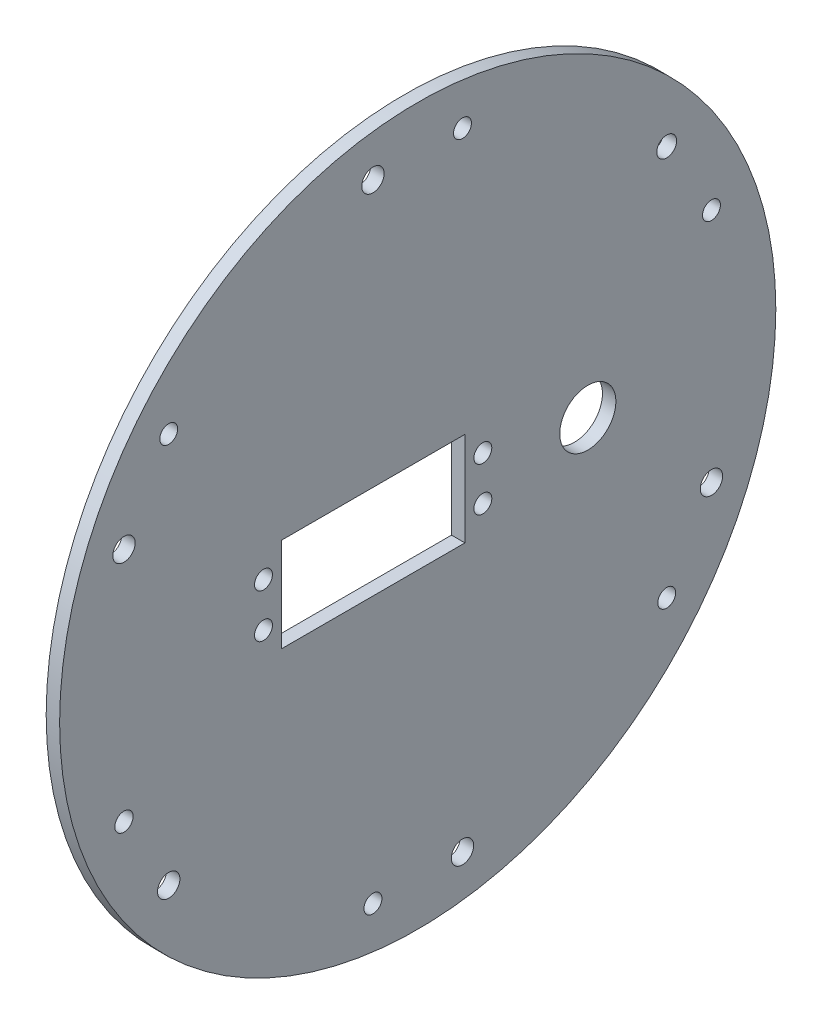
ISO-10303-21;
HEADER;
FILE_DESCRIPTION(('STEP AP214'),'2;1');
FILE_NAME('part.step','',(''),(''),'','','');
FILE_SCHEMA(('AUTOMOTIVE_DESIGN { 1 0 10303 214 1 1 1 1 }'));
ENDSEC;
DATA;
#1=APPLICATION_CONTEXT('core data for automotive mechanical design processes');
#2=APPLICATION_PROTOCOL_DEFINITION('international standard','automotive_design',2000,#1);
#3=PRODUCT_CONTEXT('',#1,'mechanical');
#4=PRODUCT('Part','Part','',(#3));
#5=PRODUCT_RELATED_PRODUCT_CATEGORY('part','',(#4));
#6=PRODUCT_DEFINITION_FORMATION('','',#4);
#7=PRODUCT_DEFINITION_CONTEXT('part definition',#1,'design');
#8=PRODUCT_DEFINITION('design','',#6,#7);
#9=PRODUCT_DEFINITION_SHAPE('','',#8);
#10=(LENGTH_UNIT() NAMED_UNIT(*) SI_UNIT(.MILLI.,.METRE.));
#11=(NAMED_UNIT(*) PLANE_ANGLE_UNIT() SI_UNIT($,.RADIAN.));
#12=(NAMED_UNIT(*) SI_UNIT($,.STERADIAN.) SOLID_ANGLE_UNIT());
#13=UNCERTAINTY_MEASURE_WITH_UNIT(LENGTH_MEASURE(1.E-05),#10,'distance_accuracy_value','');
#14=(GEOMETRIC_REPRESENTATION_CONTEXT(3) GLOBAL_UNCERTAINTY_ASSIGNED_CONTEXT((#13)) GLOBAL_UNIT_ASSIGNED_CONTEXT((#10,
#11,#12)) REPRESENTATION_CONTEXT('',''));
#15=CARTESIAN_POINT('',(0.,0.,0.));
#16=DIRECTION('',(0.,0.,1.));
#17=DIRECTION('',(1.,0.,0.));
#18=AXIS2_PLACEMENT_3D('',#15,#16,#17);
#19=CARTESIAN_POINT('',(3.,1479.49547319452,2426.87376957757));
#20=DIRECTION('',(1.,0.,0.));
#21=DIRECTION('',(0.,0.,-1.));
#22=AXIS2_PLACEMENT_3D('',#19,#20,#21);
#23=PLANE('',#22);
#24=CARTESIAN_POINT('',(3.,1435.83521915667,2482.49554784248));
#25=DIRECTION('',(1.,0.,0.));
#26=DIRECTION('',(0.,0.,-1.));
#27=AXIS2_PLACEMENT_3D('',#24,#25,#26);
#28=CIRCLE('',#27,2.5000000000001);
#29=CARTESIAN_POINT('',(3.,1435.83521915667,2479.99554784248));
#30=VERTEX_POINT('',#29);
#31=EDGE_CURVE('E117',#30,#30,#28,.T.);
#32=ORIENTED_EDGE('',*,*,#31,.F.);
#33=EDGE_LOOP('',(#32));
#34=FACE_BOUND('',#33,.T.);
#35=CARTESIAN_POINT('',(3.,1409.49547319452,2416.87376957757));
#36=DIRECTION('',(1.,0.,0.));
#37=DIRECTION('',(0.,0.,-1.));
#38=AXIS2_PLACEMENT_3D('',#35,#36,#37);
#39=CIRCLE('',#38,2.5000000000001);
#40=CARTESIAN_POINT('',(3.,1409.49547319452,2414.37376957757));
#41=VERTEX_POINT('',#40);
#42=EDGE_CURVE('E129',#41,#41,#39,.T.);
#43=ORIENTED_EDGE('',*,*,#42,.F.);
#44=EDGE_LOOP('',(#43));
#45=FACE_BOUND('',#44,.T.);
#46=CARTESIAN_POINT('',(3.,1453.15572723236,2361.25199131266));
#47=DIRECTION('',(1.,0.,0.));
#48=DIRECTION('',(0.,0.,-1.));
#49=AXIS2_PLACEMENT_3D('',#46,#47,#48);
#50=CIRCLE('',#49,2.5000000000001);
#51=CARTESIAN_POINT('',(3.,1453.15572723236,2358.75199131266));
#52=VERTEX_POINT('',#51);
#53=EDGE_CURVE('E141',#52,#52,#50,.T.);
#54=ORIENTED_EDGE('',*,*,#53,.F.);
#55=EDGE_LOOP('',(#54));
#56=FACE_BOUND('',#55,.T.);
#57=CARTESIAN_POINT('',(3.,1523.15572723236,2371.25199131266));
#58=DIRECTION('',(1.,0.,0.));
#59=DIRECTION('',(0.,0.,-1.));
#60=AXIS2_PLACEMENT_3D('',#57,#58,#59);
#61=CIRCLE('',#60,2.21453790275522);
#62=CARTESIAN_POINT('',(3.,1523.15572723236,2369.03745340991));
#63=VERTEX_POINT('',#62);
#64=EDGE_CURVE('E153',#63,#63,#61,.T.);
#65=ORIENTED_EDGE('',*,*,#64,.F.);
#66=EDGE_LOOP('',(#65));
#67=FACE_BOUND('',#66,.T.);
#68=CARTESIAN_POINT('',(3.,1549.49547319452,2436.87376957757));
#69=DIRECTION('',(1.,0.,0.));
#70=DIRECTION('',(0.,0.,-1.));
#71=AXIS2_PLACEMENT_3D('',#68,#69,#70);
#72=CIRCLE('',#71,2.49999999999967);
#73=CARTESIAN_POINT('',(3.,1549.49547319452,2434.37376957757));
#74=VERTEX_POINT('',#73);
#75=EDGE_CURVE('E165',#74,#74,#72,.T.);
#76=ORIENTED_EDGE('',*,*,#75,.F.);
#77=EDGE_LOOP('',(#76));
#78=FACE_BOUND('',#77,.T.);
#79=CARTESIAN_POINT('',(3.,1505.83521915667,2492.49554784248));
#80=DIRECTION('',(1.,0.,0.));
#81=DIRECTION('',(0.,0.,-1.));
#82=AXIS2_PLACEMENT_3D('',#79,#80,#81);
#83=CIRCLE('',#82,2.50000000000016);
#84=CARTESIAN_POINT('',(3.,1505.83521915667,2489.99554784248));
#85=VERTEX_POINT('',#84);
#86=EDGE_CURVE('E177',#85,#85,#83,.T.);
#87=ORIENTED_EDGE('',*,*,#86,.F.);
#88=EDGE_LOOP('',(#87));
#89=FACE_BOUND('',#88,.T.);
#90=CARTESIAN_POINT('',(3.,1484.39547319452,2461.32376957757));
#91=DIRECTION('',(1.,0.,0.));
#92=DIRECTION('',(0.,0.,-1.));
#93=AXIS2_PLACEMENT_3D('',#90,#91,#92);
#94=CIRCLE('',#93,1.99999999999961);
#95=CARTESIAN_POINT('',(3.,1484.39547319452,2459.32376957757));
#96=VERTEX_POINT('',#95);
#97=EDGE_CURVE('E189',#96,#96,#94,.T.);
#98=ORIENTED_EDGE('',*,*,#97,.F.);
#99=EDGE_LOOP('',(#98));
#100=FACE_BOUND('',#99,.T.);
#101=CARTESIAN_POINT('',(3.,1484.39547319452,2412.32376957757));
#102=DIRECTION('',(1.,0.,0.));
#103=DIRECTION('',(0.,0.,-1.));
#104=AXIS2_PLACEMENT_3D('',#101,#102,#103);
#105=CIRCLE('',#104,1.99999999999968);
#106=CARTESIAN_POINT('',(3.,1484.39547319452,2410.32376957757));
#107=VERTEX_POINT('',#106);
#108=EDGE_CURVE('E201',#107,#107,#105,.T.);
#109=ORIENTED_EDGE('',*,*,#108,.F.);
#110=EDGE_LOOP('',(#109));
#111=FACE_BOUND('',#110,.T.);
#112=CARTESIAN_POINT('',(3.,1479.49547319452,2426.87376957757));
#113=DIRECTION('',(1.,0.,0.));
#114=DIRECTION('',(0.,0.,-1.));
#115=AXIS2_PLACEMENT_3D('',#112,#113,#114);
#116=CIRCLE('',#115,80.0000000000003);
#117=CARTESIAN_POINT('',(3.,1479.49547319452,2346.87376957757));
#118=VERTEX_POINT('',#117);
#119=EDGE_CURVE('E11',#118,#118,#116,.T.);
#120=ORIENTED_EDGE('',*,*,#119,.T.);
#121=EDGE_LOOP('',(#120));
#122=FACE_BOUND('',#121,.T.);
#123=CARTESIAN_POINT('',(3.,1479.49547319452,2388.87376957757));
#124=DIRECTION('',(1.,0.,0.));
#125=DIRECTION('',(0.,0.,-1.));
#126=AXIS2_PLACEMENT_3D('',#123,#124,#125);
#127=CIRCLE('',#126,6.26995214826625);
#128=CARTESIAN_POINT('',(3.,1479.49547319452,2382.60381742931));
#129=VERTEX_POINT('',#128);
#130=EDGE_CURVE('E207',#129,#129,#127,.T.);
#131=ORIENTED_EDGE('',*,*,#130,.F.);
#132=EDGE_LOOP('',(#131));
#133=FACE_BOUND('',#132,.T.);
#134=CARTESIAN_POINT('',(3.,1474.59547319452,2412.32376957757));
#135=DIRECTION('',(1.,0.,0.));
#136=DIRECTION('',(0.,0.,-1.));
#137=AXIS2_PLACEMENT_3D('',#134,#135,#136);
#138=CIRCLE('',#137,1.99999999999968);
#139=CARTESIAN_POINT('',(3.,1474.59547319452,2410.32376957757));
#140=VERTEX_POINT('',#139);
#141=EDGE_CURVE('E195',#140,#140,#138,.T.);
#142=ORIENTED_EDGE('',*,*,#141,.F.);
#143=EDGE_LOOP('',(#142));
#144=FACE_BOUND('',#143,.T.);
#145=CARTESIAN_POINT('',(3.,1474.59547319452,2461.32376957757));
#146=DIRECTION('',(1.,0.,0.));
#147=DIRECTION('',(0.,0.,-1.));
#148=AXIS2_PLACEMENT_3D('',#145,#146,#147);
#149=CIRCLE('',#148,1.99999999999968);
#150=CARTESIAN_POINT('',(3.,1474.59547319452,2459.32376957757));
#151=VERTEX_POINT('',#150);
#152=EDGE_CURVE('E183',#151,#151,#149,.T.);
#153=ORIENTED_EDGE('',*,*,#152,.F.);
#154=EDGE_LOOP('',(#153));
#155=FACE_BOUND('',#154,.T.);
#156=CARTESIAN_POINT('',(3.,1523.15572723236,2482.49554784248));
#157=DIRECTION('',(1.,0.,0.));
#158=DIRECTION('',(0.,0.,-1.));
#159=AXIS2_PLACEMENT_3D('',#156,#157,#158);
#160=CIRCLE('',#159,2.0000000000001);
#161=CARTESIAN_POINT('',(3.,1523.15572723236,2480.49554784248));
#162=VERTEX_POINT('',#161);
#163=EDGE_CURVE('E171',#162,#162,#160,.T.);
#164=ORIENTED_EDGE('',*,*,#163,.F.);
#165=EDGE_LOOP('',(#164));
#166=FACE_BOUND('',#165,.T.);
#167=CARTESIAN_POINT('',(3.,1549.49547319452,2416.87376957757));
#168=DIRECTION('',(1.,0.,0.));
#169=DIRECTION('',(0.,0.,-1.));
#170=AXIS2_PLACEMENT_3D('',#167,#168,#169);
#171=CIRCLE('',#170,1.99999999999961);
#172=CARTESIAN_POINT('',(3.,1549.49547319452,2414.87376957757));
#173=VERTEX_POINT('',#172);
#174=EDGE_CURVE('E159',#173,#173,#171,.T.);
#175=ORIENTED_EDGE('',*,*,#174,.F.);
#176=EDGE_LOOP('',(#175));
#177=FACE_BOUND('',#176,.T.);
#178=CARTESIAN_POINT('',(3.,1505.83521915667,2361.25199131266));
#179=DIRECTION('',(1.,0.,0.));
#180=DIRECTION('',(0.,0.,-1.));
#181=AXIS2_PLACEMENT_3D('',#178,#179,#180);
#182=CIRCLE('',#181,1.99999999999968);
#183=CARTESIAN_POINT('',(3.,1505.83521915667,2359.25199131266));
#184=VERTEX_POINT('',#183);
#185=EDGE_CURVE('E147',#184,#184,#182,.T.);
#186=ORIENTED_EDGE('',*,*,#185,.F.);
#187=EDGE_LOOP('',(#186));
#188=FACE_BOUND('',#187,.T.);
#189=CARTESIAN_POINT('',(3.,1435.83521915667,2371.25199131266));
#190=DIRECTION('',(1.,0.,0.));
#191=DIRECTION('',(0.,0.,-1.));
#192=AXIS2_PLACEMENT_3D('',#189,#190,#191);
#193=CIRCLE('',#192,1.99999999999968);
#194=CARTESIAN_POINT('',(3.,1435.83521915667,2369.25199131266));
#195=VERTEX_POINT('',#194);
#196=EDGE_CURVE('E135',#195,#195,#193,.T.);
#197=ORIENTED_EDGE('',*,*,#196,.F.);
#198=EDGE_LOOP('',(#197));
#199=FACE_BOUND('',#198,.T.);
#200=CARTESIAN_POINT('',(3.,1409.49547319452,2436.87376957757));
#201=DIRECTION('',(1.,0.,0.));
#202=DIRECTION('',(0.,0.,-1.));
#203=AXIS2_PLACEMENT_3D('',#200,#201,#202);
#204=CIRCLE('',#203,1.99999999999968);
#205=CARTESIAN_POINT('',(3.,1409.49547319452,2434.87376957757));
#206=VERTEX_POINT('',#205);
#207=EDGE_CURVE('E123',#206,#206,#204,.T.);
#208=ORIENTED_EDGE('',*,*,#207,.F.);
#209=EDGE_LOOP('',(#208));
#210=FACE_BOUND('',#209,.T.);
#211=CARTESIAN_POINT('',(3.,1453.15572723236,2492.49554784248));
#212=DIRECTION('',(1.,0.,0.));
#213=DIRECTION('',(0.,0.,-1.));
#214=AXIS2_PLACEMENT_3D('',#211,#212,#213);
#215=CIRCLE('',#214,2.03949019728246);
#216=CARTESIAN_POINT('',(3.,1453.15572723236,2490.4560576452));
#217=VERTEX_POINT('',#216);
#218=EDGE_CURVE('E111',#217,#217,#215,.T.);
#219=ORIENTED_EDGE('',*,*,#218,.F.);
#220=EDGE_LOOP('',(#219));
#221=FACE_BOUND('',#220,.T.);
#222=DIRECTION('',(0.,0.,-1.));
#223=VECTOR('',#222,1.);
#224=CARTESIAN_POINT('',(3.,1468.99547319452,2457.32376957757));
#225=LINE('',#224,#223);
#226=CARTESIAN_POINT('',(3.,1468.99547319452,2457.32376957757));
#227=VERTEX_POINT('',#226);
#228=CARTESIAN_POINT('',(3.,1468.99547319452,2416.32376957757));
#229=VERTEX_POINT('',#228);
#230=EDGE_CURVE('E83',#227,#229,#225,.T.);
#231=ORIENTED_EDGE('',*,*,#230,.F.);
#232=DIRECTION('',(0.,-1.,0.));
#233=VECTOR('',#232,1.);
#234=CARTESIAN_POINT('',(3.,1489.99547319452,2457.32376957757));
#235=LINE('',#234,#233);
#236=CARTESIAN_POINT('',(3.,1489.99547319452,2457.32376957757));
#237=VERTEX_POINT('',#236);
#238=EDGE_CURVE('E75',#237,#227,#235,.T.);
#239=ORIENTED_EDGE('',*,*,#238,.F.);
#240=DIRECTION('',(0.,0.,1.));
#241=VECTOR('',#240,1.);
#242=CARTESIAN_POINT('',(3.,1489.99547319452,2457.32376957757));
#243=LINE('',#242,#241);
#244=CARTESIAN_POINT('',(3.,1489.99547319452,2416.32376957757));
#245=VERTEX_POINT('',#244);
#246=EDGE_CURVE('E97',#245,#237,#243,.T.);
#247=ORIENTED_EDGE('',*,*,#246,.F.);
#248=DIRECTION('',(0.,1.,0.));
#249=VECTOR('',#248,1.);
#250=CARTESIAN_POINT('',(3.,1489.99547319452,2416.32376957757));
#251=LINE('',#250,#249);
#252=EDGE_CURVE('E95',#229,#245,#251,.T.);
#253=ORIENTED_EDGE('',*,*,#252,.F.);
#254=EDGE_LOOP('',(#231,#239,#247,#253));
#255=FACE_BOUND('',#254,.T.);
#256=ADVANCED_FACE('F34',(#34,#45,#56,#67,#78,#89,#100,#111,#122,#133,#144,#155,#166,#177,#188,
#199,#210,#221,#255),#23,.T.);
#257=CARTESIAN_POINT('',(0.,1479.49547319452,2426.87376957757));
#258=DIRECTION('',(1.,0.,0.));
#259=DIRECTION('',(0.,0.,-1.));
#260=AXIS2_PLACEMENT_3D('',#257,#258,#259);
#261=PLANE('',#260);
#262=CARTESIAN_POINT('',(0.,1453.15572723236,2492.49554784248));
#263=DIRECTION('',(1.,0.,0.));
#264=DIRECTION('',(0.,0.,-1.));
#265=AXIS2_PLACEMENT_3D('',#262,#263,#264);
#266=CIRCLE('',#265,2.03949019728246);
#267=CARTESIAN_POINT('',(0.,1453.15572723236,2490.4560576452));
#268=VERTEX_POINT('',#267);
#269=EDGE_CURVE('E91',#268,#268,#266,.T.);
#270=ORIENTED_EDGE('',*,*,#269,.T.);
#271=EDGE_LOOP('',(#270));
#272=FACE_BOUND('',#271,.T.);
#273=CARTESIAN_POINT('',(0.,1435.83521915667,2482.49554784248));
#274=DIRECTION('',(1.,0.,0.));
#275=DIRECTION('',(0.,0.,-1.));
#276=AXIS2_PLACEMENT_3D('',#273,#274,#275);
#277=CIRCLE('',#276,2.5000000000001);
#278=CARTESIAN_POINT('',(0.,1435.83521915667,2479.99554784248));
#279=VERTEX_POINT('',#278);
#280=EDGE_CURVE('E114',#279,#279,#277,.T.);
#281=ORIENTED_EDGE('',*,*,#280,.T.);
#282=EDGE_LOOP('',(#281));
#283=FACE_BOUND('',#282,.T.);
#284=CARTESIAN_POINT('',(0.,1409.49547319452,2436.87376957757));
#285=DIRECTION('',(1.,0.,0.));
#286=DIRECTION('',(0.,0.,-1.));
#287=AXIS2_PLACEMENT_3D('',#284,#285,#286);
#288=CIRCLE('',#287,1.99999999999968);
#289=CARTESIAN_POINT('',(0.,1409.49547319452,2434.87376957757));
#290=VERTEX_POINT('',#289);
#291=EDGE_CURVE('E120',#290,#290,#288,.T.);
#292=ORIENTED_EDGE('',*,*,#291,.T.);
#293=EDGE_LOOP('',(#292));
#294=FACE_BOUND('',#293,.T.);
#295=CARTESIAN_POINT('',(0.,1409.49547319452,2416.87376957757));
#296=DIRECTION('',(1.,0.,0.));
#297=DIRECTION('',(0.,0.,-1.));
#298=AXIS2_PLACEMENT_3D('',#295,#296,#297);
#299=CIRCLE('',#298,2.5000000000001);
#300=CARTESIAN_POINT('',(0.,1409.49547319452,2414.37376957757));
#301=VERTEX_POINT('',#300);
#302=EDGE_CURVE('E126',#301,#301,#299,.T.);
#303=ORIENTED_EDGE('',*,*,#302,.T.);
#304=EDGE_LOOP('',(#303));
#305=FACE_BOUND('',#304,.T.);
#306=CARTESIAN_POINT('',(0.,1435.83521915667,2371.25199131266));
#307=DIRECTION('',(1.,0.,0.));
#308=DIRECTION('',(0.,0.,-1.));
#309=AXIS2_PLACEMENT_3D('',#306,#307,#308);
#310=CIRCLE('',#309,1.99999999999968);
#311=CARTESIAN_POINT('',(0.,1435.83521915667,2369.25199131266));
#312=VERTEX_POINT('',#311);
#313=EDGE_CURVE('E132',#312,#312,#310,.T.);
#314=ORIENTED_EDGE('',*,*,#313,.T.);
#315=EDGE_LOOP('',(#314));
#316=FACE_BOUND('',#315,.T.);
#317=CARTESIAN_POINT('',(0.,1453.15572723236,2361.25199131266));
#318=DIRECTION('',(1.,0.,0.));
#319=DIRECTION('',(0.,0.,-1.));
#320=AXIS2_PLACEMENT_3D('',#317,#318,#319);
#321=CIRCLE('',#320,2.5000000000001);
#322=CARTESIAN_POINT('',(0.,1453.15572723236,2358.75199131266));
#323=VERTEX_POINT('',#322);
#324=EDGE_CURVE('E138',#323,#323,#321,.T.);
#325=ORIENTED_EDGE('',*,*,#324,.T.);
#326=EDGE_LOOP('',(#325));
#327=FACE_BOUND('',#326,.T.);
#328=CARTESIAN_POINT('',(0.,1505.83521915667,2361.25199131266));
#329=DIRECTION('',(1.,0.,0.));
#330=DIRECTION('',(0.,0.,-1.));
#331=AXIS2_PLACEMENT_3D('',#328,#329,#330);
#332=CIRCLE('',#331,1.99999999999968);
#333=CARTESIAN_POINT('',(0.,1505.83521915667,2359.25199131266));
#334=VERTEX_POINT('',#333);
#335=EDGE_CURVE('E144',#334,#334,#332,.T.);
#336=ORIENTED_EDGE('',*,*,#335,.T.);
#337=EDGE_LOOP('',(#336));
#338=FACE_BOUND('',#337,.T.);
#339=CARTESIAN_POINT('',(0.,1523.15572723236,2371.25199131266));
#340=DIRECTION('',(1.,0.,0.));
#341=DIRECTION('',(0.,0.,-1.));
#342=AXIS2_PLACEMENT_3D('',#339,#340,#341);
#343=CIRCLE('',#342,2.21453790275522);
#344=CARTESIAN_POINT('',(0.,1523.15572723236,2369.03745340991));
#345=VERTEX_POINT('',#344);
#346=EDGE_CURVE('E150',#345,#345,#343,.T.);
#347=ORIENTED_EDGE('',*,*,#346,.T.);
#348=EDGE_LOOP('',(#347));
#349=FACE_BOUND('',#348,.T.);
#350=CARTESIAN_POINT('',(0.,1549.49547319452,2416.87376957757));
#351=DIRECTION('',(1.,0.,0.));
#352=DIRECTION('',(0.,0.,-1.));
#353=AXIS2_PLACEMENT_3D('',#350,#351,#352);
#354=CIRCLE('',#353,1.99999999999961);
#355=CARTESIAN_POINT('',(0.,1549.49547319452,2414.87376957757));
#356=VERTEX_POINT('',#355);
#357=EDGE_CURVE('E156',#356,#356,#354,.T.);
#358=ORIENTED_EDGE('',*,*,#357,.T.);
#359=EDGE_LOOP('',(#358));
#360=FACE_BOUND('',#359,.T.);
#361=CARTESIAN_POINT('',(0.,1549.49547319452,2436.87376957757));
#362=DIRECTION('',(1.,0.,0.));
#363=DIRECTION('',(0.,0.,-1.));
#364=AXIS2_PLACEMENT_3D('',#361,#362,#363);
#365=CIRCLE('',#364,2.49999999999967);
#366=CARTESIAN_POINT('',(0.,1549.49547319452,2434.37376957757));
#367=VERTEX_POINT('',#366);
#368=EDGE_CURVE('E162',#367,#367,#365,.T.);
#369=ORIENTED_EDGE('',*,*,#368,.T.);
#370=EDGE_LOOP('',(#369));
#371=FACE_BOUND('',#370,.T.);
#372=CARTESIAN_POINT('',(0.,1523.15572723236,2482.49554784248));
#373=DIRECTION('',(1.,0.,0.));
#374=DIRECTION('',(0.,0.,-1.));
#375=AXIS2_PLACEMENT_3D('',#372,#373,#374);
#376=CIRCLE('',#375,2.0000000000001);
#377=CARTESIAN_POINT('',(0.,1523.15572723236,2480.49554784248));
#378=VERTEX_POINT('',#377);
#379=EDGE_CURVE('E168',#378,#378,#376,.T.);
#380=ORIENTED_EDGE('',*,*,#379,.T.);
#381=EDGE_LOOP('',(#380));
#382=FACE_BOUND('',#381,.T.);
#383=CARTESIAN_POINT('',(0.,1505.83521915667,2492.49554784248));
#384=DIRECTION('',(1.,0.,0.));
#385=DIRECTION('',(0.,0.,-1.));
#386=AXIS2_PLACEMENT_3D('',#383,#384,#385);
#387=CIRCLE('',#386,2.50000000000016);
#388=CARTESIAN_POINT('',(0.,1505.83521915667,2489.99554784248));
#389=VERTEX_POINT('',#388);
#390=EDGE_CURVE('E174',#389,#389,#387,.T.);
#391=ORIENTED_EDGE('',*,*,#390,.T.);
#392=EDGE_LOOP('',(#391));
#393=FACE_BOUND('',#392,.T.);
#394=CARTESIAN_POINT('',(0.,1474.59547319452,2461.32376957757));
#395=DIRECTION('',(1.,0.,0.));
#396=DIRECTION('',(0.,0.,-1.));
#397=AXIS2_PLACEMENT_3D('',#394,#395,#396);
#398=CIRCLE('',#397,1.99999999999968);
#399=CARTESIAN_POINT('',(0.,1474.59547319452,2459.32376957757));
#400=VERTEX_POINT('',#399);
#401=EDGE_CURVE('E180',#400,#400,#398,.T.);
#402=ORIENTED_EDGE('',*,*,#401,.T.);
#403=EDGE_LOOP('',(#402));
#404=FACE_BOUND('',#403,.T.);
#405=CARTESIAN_POINT('',(0.,1484.39547319452,2461.32376957757));
#406=DIRECTION('',(1.,0.,0.));
#407=DIRECTION('',(0.,0.,-1.));
#408=AXIS2_PLACEMENT_3D('',#405,#406,#407);
#409=CIRCLE('',#408,1.99999999999961);
#410=CARTESIAN_POINT('',(0.,1484.39547319452,2459.32376957757));
#411=VERTEX_POINT('',#410);
#412=EDGE_CURVE('E186',#411,#411,#409,.T.);
#413=ORIENTED_EDGE('',*,*,#412,.T.);
#414=EDGE_LOOP('',(#413));
#415=FACE_BOUND('',#414,.T.);
#416=CARTESIAN_POINT('',(0.,1474.59547319452,2412.32376957757));
#417=DIRECTION('',(1.,0.,0.));
#418=DIRECTION('',(0.,0.,-1.));
#419=AXIS2_PLACEMENT_3D('',#416,#417,#418);
#420=CIRCLE('',#419,1.99999999999968);
#421=CARTESIAN_POINT('',(0.,1474.59547319452,2410.32376957757));
#422=VERTEX_POINT('',#421);
#423=EDGE_CURVE('E192',#422,#422,#420,.T.);
#424=ORIENTED_EDGE('',*,*,#423,.T.);
#425=EDGE_LOOP('',(#424));
#426=FACE_BOUND('',#425,.T.);
#427=CARTESIAN_POINT('',(0.,1484.39547319452,2412.32376957757));
#428=DIRECTION('',(1.,0.,0.));
#429=DIRECTION('',(0.,0.,-1.));
#430=AXIS2_PLACEMENT_3D('',#427,#428,#429);
#431=CIRCLE('',#430,1.99999999999968);
#432=CARTESIAN_POINT('',(0.,1484.39547319452,2410.32376957757));
#433=VERTEX_POINT('',#432);
#434=EDGE_CURVE('E198',#433,#433,#431,.T.);
#435=ORIENTED_EDGE('',*,*,#434,.T.);
#436=EDGE_LOOP('',(#435));
#437=FACE_BOUND('',#436,.T.);
#438=CARTESIAN_POINT('',(0.,1479.49547319452,2388.87376957757));
#439=DIRECTION('',(1.,0.,0.));
#440=DIRECTION('',(0.,0.,-1.));
#441=AXIS2_PLACEMENT_3D('',#438,#439,#440);
#442=CIRCLE('',#441,6.26995214826625);
#443=CARTESIAN_POINT('',(0.,1479.49547319452,2382.60381742931));
#444=VERTEX_POINT('',#443);
#445=EDGE_CURVE('E204',#444,#444,#442,.T.);
#446=ORIENTED_EDGE('',*,*,#445,.T.);
#447=EDGE_LOOP('',(#446));
#448=FACE_BOUND('',#447,.T.);
#449=CARTESIAN_POINT('',(0.,1479.49547319452,2426.87376957757));
#450=DIRECTION('',(1.,0.,0.));
#451=DIRECTION('',(0.,0.,-1.));
#452=AXIS2_PLACEMENT_3D('',#449,#450,#451);
#453=CIRCLE('',#452,80.0000000000003);
#454=CARTESIAN_POINT('',(0.,1479.49547319452,2346.87376957757));
#455=VERTEX_POINT('',#454);
#456=EDGE_CURVE('E38',#455,#455,#453,.T.);
#457=ORIENTED_EDGE('',*,*,#456,.F.);
#458=EDGE_LOOP('',(#457));
#459=FACE_BOUND('',#458,.T.);
#460=DIRECTION('',(0.,-1.,0.));
#461=VECTOR('',#460,1.);
#462=CARTESIAN_POINT('',(0.,1489.99547319452,2457.32376957757));
#463=LINE('',#462,#461);
#464=CARTESIAN_POINT('',(0.,1489.99547319452,2457.32376957757));
#465=VERTEX_POINT('',#464);
#466=CARTESIAN_POINT('',(0.,1468.99547319452,2457.32376957757));
#467=VERTEX_POINT('',#466);
#468=EDGE_CURVE('E57',#465,#467,#463,.T.);
#469=ORIENTED_EDGE('',*,*,#468,.T.);
#470=DIRECTION('',(0.,0.,-1.));
#471=VECTOR('',#470,1.);
#472=CARTESIAN_POINT('',(0.,1468.99547319452,2457.32376957757));
#473=LINE('',#472,#471);
#474=CARTESIAN_POINT('',(0.,1468.99547319452,2416.32376957757));
#475=VERTEX_POINT('',#474);
#476=EDGE_CURVE('E90',#467,#475,#473,.T.);
#477=ORIENTED_EDGE('',*,*,#476,.T.);
#478=DIRECTION('',(0.,1.,0.));
#479=VECTOR('',#478,1.);
#480=CARTESIAN_POINT('',(0.,1489.99547319452,2416.32376957757));
#481=LINE('',#480,#479);
#482=CARTESIAN_POINT('',(0.,1489.99547319452,2416.32376957757));
#483=VERTEX_POINT('',#482);
#484=EDGE_CURVE('E103',#475,#483,#481,.T.);
#485=ORIENTED_EDGE('',*,*,#484,.T.);
#486=DIRECTION('',(0.,0.,1.));
#487=VECTOR('',#486,1.);
#488=CARTESIAN_POINT('',(0.,1489.99547319452,2457.32376957757));
#489=LINE('',#488,#487);
#490=EDGE_CURVE('E84',#483,#465,#489,.T.);
#491=ORIENTED_EDGE('',*,*,#490,.T.);
#492=EDGE_LOOP('',(#469,#477,#485,#491));
#493=FACE_BOUND('',#492,.T.);
#494=ADVANCED_FACE('F213',(#272,#283,#294,#305,#316,#327,#338,#349,#360,#371,#382,#393,#404,
#415,#426,#437,#448,#459,#493),#261,.F.);
#495=CARTESIAN_POINT('',(3.,1479.49547319452,2426.87376957757));
#496=DIRECTION('',(-1.,0.,0.));
#497=DIRECTION('',(0.,0.,1.));
#498=AXIS2_PLACEMENT_3D('',#495,#496,#497);
#499=CYLINDRICAL_SURFACE('',#498,80.0000000000003);
#500=ORIENTED_EDGE('',*,*,#119,.F.);
#501=EDGE_LOOP('',(#500));
#502=FACE_BOUND('',#501,.T.);
#503=ORIENTED_EDGE('',*,*,#456,.T.);
#504=EDGE_LOOP('',(#503));
#505=FACE_BOUND('',#504,.T.);
#506=ADVANCED_FACE('F36',(#502,#505),#499,.T.);
#507=CARTESIAN_POINT('',(3.,1479.49547319452,2388.87376957757));
#508=DIRECTION('',(-1.,0.,0.));
#509=DIRECTION('',(0.,0.,1.));
#510=AXIS2_PLACEMENT_3D('',#507,#508,#509);
#511=CYLINDRICAL_SURFACE('',#510,6.26995214826625);
#512=ORIENTED_EDGE('',*,*,#130,.T.);
#513=EDGE_LOOP('',(#512));
#514=FACE_BOUND('',#513,.T.);
#515=ORIENTED_EDGE('',*,*,#445,.F.);
#516=EDGE_LOOP('',(#515));
#517=FACE_BOUND('',#516,.T.);
#518=ADVANCED_FACE('F216',(#514,#517),#511,.F.);
#519=CARTESIAN_POINT('',(3.,1484.39547319452,2412.32376957757));
#520=DIRECTION('',(-1.,0.,0.));
#521=DIRECTION('',(0.,0.,1.));
#522=AXIS2_PLACEMENT_3D('',#519,#520,#521);
#523=CYLINDRICAL_SURFACE('',#522,1.99999999999968);
#524=ORIENTED_EDGE('',*,*,#108,.T.);
#525=EDGE_LOOP('',(#524));
#526=FACE_BOUND('',#525,.T.);
#527=ORIENTED_EDGE('',*,*,#434,.F.);
#528=EDGE_LOOP('',(#527));
#529=FACE_BOUND('',#528,.T.);
#530=ADVANCED_FACE('F218',(#526,#529),#523,.F.);
#531=CARTESIAN_POINT('',(3.,1474.59547319452,2412.32376957757));
#532=DIRECTION('',(-1.,0.,0.));
#533=DIRECTION('',(0.,0.,1.));
#534=AXIS2_PLACEMENT_3D('',#531,#532,#533);
#535=CYLINDRICAL_SURFACE('',#534,1.99999999999968);
#536=ORIENTED_EDGE('',*,*,#141,.T.);
#537=EDGE_LOOP('',(#536));
#538=FACE_BOUND('',#537,.T.);
#539=ORIENTED_EDGE('',*,*,#423,.F.);
#540=EDGE_LOOP('',(#539));
#541=FACE_BOUND('',#540,.T.);
#542=ADVANCED_FACE('F225',(#538,#541),#535,.F.);
#543=CARTESIAN_POINT('',(3.,1484.39547319452,2461.32376957757));
#544=DIRECTION('',(-1.,0.,0.));
#545=DIRECTION('',(0.,0.,1.));
#546=AXIS2_PLACEMENT_3D('',#543,#544,#545);
#547=CYLINDRICAL_SURFACE('',#546,1.99999999999961);
#548=ORIENTED_EDGE('',*,*,#97,.T.);
#549=EDGE_LOOP('',(#548));
#550=FACE_BOUND('',#549,.T.);
#551=ORIENTED_EDGE('',*,*,#412,.F.);
#552=EDGE_LOOP('',(#551));
#553=FACE_BOUND('',#552,.T.);
#554=ADVANCED_FACE('F311',(#550,#553),#547,.F.);
#555=CARTESIAN_POINT('',(3.,1474.59547319452,2461.32376957757));
#556=DIRECTION('',(-1.,0.,0.));
#557=DIRECTION('',(0.,0.,1.));
#558=AXIS2_PLACEMENT_3D('',#555,#556,#557);
#559=CYLINDRICAL_SURFACE('',#558,1.99999999999968);
#560=ORIENTED_EDGE('',*,*,#152,.T.);
#561=EDGE_LOOP('',(#560));
#562=FACE_BOUND('',#561,.T.);
#563=ORIENTED_EDGE('',*,*,#401,.F.);
#564=EDGE_LOOP('',(#563));
#565=FACE_BOUND('',#564,.T.);
#566=ADVANCED_FACE('F317',(#562,#565),#559,.F.);
#567=CARTESIAN_POINT('',(3.,1505.83521915667,2492.49554784248));
#568=DIRECTION('',(-1.,0.,0.));
#569=DIRECTION('',(0.,0.,1.));
#570=AXIS2_PLACEMENT_3D('',#567,#568,#569);
#571=CYLINDRICAL_SURFACE('',#570,2.50000000000016);
#572=ORIENTED_EDGE('',*,*,#86,.T.);
#573=EDGE_LOOP('',(#572));
#574=FACE_BOUND('',#573,.T.);
#575=ORIENTED_EDGE('',*,*,#390,.F.);
#576=EDGE_LOOP('',(#575));
#577=FACE_BOUND('',#576,.T.);
#578=ADVANCED_FACE('F323',(#574,#577),#571,.F.);
#579=CARTESIAN_POINT('',(3.,1523.15572723236,2482.49554784248));
#580=DIRECTION('',(-1.,0.,0.));
#581=DIRECTION('',(0.,0.,1.));
#582=AXIS2_PLACEMENT_3D('',#579,#580,#581);
#583=CYLINDRICAL_SURFACE('',#582,2.0000000000001);
#584=ORIENTED_EDGE('',*,*,#163,.T.);
#585=EDGE_LOOP('',(#584));
#586=FACE_BOUND('',#585,.T.);
#587=ORIENTED_EDGE('',*,*,#379,.F.);
#588=EDGE_LOOP('',(#587));
#589=FACE_BOUND('',#588,.T.);
#590=ADVANCED_FACE('F327',(#586,#589),#583,.F.);
#591=CARTESIAN_POINT('',(3.,1549.49547319452,2436.87376957757));
#592=DIRECTION('',(-1.,0.,0.));
#593=DIRECTION('',(0.,0.,1.));
#594=AXIS2_PLACEMENT_3D('',#591,#592,#593);
#595=CYLINDRICAL_SURFACE('',#594,2.49999999999967);
#596=ORIENTED_EDGE('',*,*,#75,.T.);
#597=EDGE_LOOP('',(#596));
#598=FACE_BOUND('',#597,.T.);
#599=ORIENTED_EDGE('',*,*,#368,.F.);
#600=EDGE_LOOP('',(#599));
#601=FACE_BOUND('',#600,.T.);
#602=ADVANCED_FACE('F331',(#598,#601),#595,.F.);
#603=CARTESIAN_POINT('',(3.,1549.49547319452,2416.87376957757));
#604=DIRECTION('',(-1.,0.,0.));
#605=DIRECTION('',(0.,0.,1.));
#606=AXIS2_PLACEMENT_3D('',#603,#604,#605);
#607=CYLINDRICAL_SURFACE('',#606,1.99999999999961);
#608=ORIENTED_EDGE('',*,*,#174,.T.);
#609=EDGE_LOOP('',(#608));
#610=FACE_BOUND('',#609,.T.);
#611=ORIENTED_EDGE('',*,*,#357,.F.);
#612=EDGE_LOOP('',(#611));
#613=FACE_BOUND('',#612,.T.);
#614=ADVANCED_FACE('F335',(#610,#613),#607,.F.);
#615=CARTESIAN_POINT('',(3.,1523.15572723236,2371.25199131266));
#616=DIRECTION('',(-1.,0.,0.));
#617=DIRECTION('',(0.,0.,1.));
#618=AXIS2_PLACEMENT_3D('',#615,#616,#617);
#619=CYLINDRICAL_SURFACE('',#618,2.21453790275522);
#620=ORIENTED_EDGE('',*,*,#64,.T.);
#621=EDGE_LOOP('',(#620));
#622=FACE_BOUND('',#621,.T.);
#623=ORIENTED_EDGE('',*,*,#346,.F.);
#624=EDGE_LOOP('',(#623));
#625=FACE_BOUND('',#624,.T.);
#626=ADVANCED_FACE('F339',(#622,#625),#619,.F.);
#627=CARTESIAN_POINT('',(3.,1505.83521915667,2361.25199131266));
#628=DIRECTION('',(-1.,0.,0.));
#629=DIRECTION('',(0.,0.,1.));
#630=AXIS2_PLACEMENT_3D('',#627,#628,#629);
#631=CYLINDRICAL_SURFACE('',#630,1.99999999999968);
#632=ORIENTED_EDGE('',*,*,#185,.T.);
#633=EDGE_LOOP('',(#632));
#634=FACE_BOUND('',#633,.T.);
#635=ORIENTED_EDGE('',*,*,#335,.F.);
#636=EDGE_LOOP('',(#635));
#637=FACE_BOUND('',#636,.T.);
#638=ADVANCED_FACE('F343',(#634,#637),#631,.F.);
#639=CARTESIAN_POINT('',(3.,1453.15572723236,2361.25199131266));
#640=DIRECTION('',(-1.,0.,0.));
#641=DIRECTION('',(0.,0.,1.));
#642=AXIS2_PLACEMENT_3D('',#639,#640,#641);
#643=CYLINDRICAL_SURFACE('',#642,2.5000000000001);
#644=ORIENTED_EDGE('',*,*,#53,.T.);
#645=EDGE_LOOP('',(#644));
#646=FACE_BOUND('',#645,.T.);
#647=ORIENTED_EDGE('',*,*,#324,.F.);
#648=EDGE_LOOP('',(#647));
#649=FACE_BOUND('',#648,.T.);
#650=ADVANCED_FACE('F347',(#646,#649),#643,.F.);
#651=CARTESIAN_POINT('',(3.,1435.83521915667,2371.25199131266));
#652=DIRECTION('',(-1.,0.,0.));
#653=DIRECTION('',(0.,0.,1.));
#654=AXIS2_PLACEMENT_3D('',#651,#652,#653);
#655=CYLINDRICAL_SURFACE('',#654,1.99999999999968);
#656=ORIENTED_EDGE('',*,*,#196,.T.);
#657=EDGE_LOOP('',(#656));
#658=FACE_BOUND('',#657,.T.);
#659=ORIENTED_EDGE('',*,*,#313,.F.);
#660=EDGE_LOOP('',(#659));
#661=FACE_BOUND('',#660,.T.);
#662=ADVANCED_FACE('F351',(#658,#661),#655,.F.);
#663=CARTESIAN_POINT('',(3.,1409.49547319452,2416.87376957757));
#664=DIRECTION('',(-1.,0.,0.));
#665=DIRECTION('',(0.,0.,1.));
#666=AXIS2_PLACEMENT_3D('',#663,#664,#665);
#667=CYLINDRICAL_SURFACE('',#666,2.5000000000001);
#668=ORIENTED_EDGE('',*,*,#42,.T.);
#669=EDGE_LOOP('',(#668));
#670=FACE_BOUND('',#669,.T.);
#671=ORIENTED_EDGE('',*,*,#302,.F.);
#672=EDGE_LOOP('',(#671));
#673=FACE_BOUND('',#672,.T.);
#674=ADVANCED_FACE('F355',(#670,#673),#667,.F.);
#675=CARTESIAN_POINT('',(3.,1409.49547319452,2436.87376957757));
#676=DIRECTION('',(-1.,0.,0.));
#677=DIRECTION('',(0.,0.,1.));
#678=AXIS2_PLACEMENT_3D('',#675,#676,#677);
#679=CYLINDRICAL_SURFACE('',#678,1.99999999999968);
#680=ORIENTED_EDGE('',*,*,#207,.T.);
#681=EDGE_LOOP('',(#680));
#682=FACE_BOUND('',#681,.T.);
#683=ORIENTED_EDGE('',*,*,#291,.F.);
#684=EDGE_LOOP('',(#683));
#685=FACE_BOUND('',#684,.T.);
#686=ADVANCED_FACE('F359',(#682,#685),#679,.F.);
#687=CARTESIAN_POINT('',(3.,1435.83521915667,2482.49554784248));
#688=DIRECTION('',(-1.,0.,0.));
#689=DIRECTION('',(0.,0.,1.));
#690=AXIS2_PLACEMENT_3D('',#687,#688,#689);
#691=CYLINDRICAL_SURFACE('',#690,2.5000000000001);
#692=ORIENTED_EDGE('',*,*,#31,.T.);
#693=EDGE_LOOP('',(#692));
#694=FACE_BOUND('',#693,.T.);
#695=ORIENTED_EDGE('',*,*,#280,.F.);
#696=EDGE_LOOP('',(#695));
#697=FACE_BOUND('',#696,.T.);
#698=ADVANCED_FACE('F275',(#694,#697),#691,.F.);
#699=CARTESIAN_POINT('',(3.,1453.15572723236,2492.49554784248));
#700=DIRECTION('',(-1.,0.,0.));
#701=DIRECTION('',(0.,0.,1.));
#702=AXIS2_PLACEMENT_3D('',#699,#700,#701);
#703=CYLINDRICAL_SURFACE('',#702,2.03949019728246);
#704=ORIENTED_EDGE('',*,*,#218,.T.);
#705=EDGE_LOOP('',(#704));
#706=FACE_BOUND('',#705,.T.);
#707=ORIENTED_EDGE('',*,*,#269,.F.);
#708=EDGE_LOOP('',(#707));
#709=FACE_BOUND('',#708,.T.);
#710=ADVANCED_FACE('F272',(#706,#709),#703,.F.);
#711=CARTESIAN_POINT('',(3.,1489.99547319452,2457.32376957757));
#712=DIRECTION('',(0.,0.,-1.));
#713=DIRECTION('',(-1.,0.,0.));
#714=AXIS2_PLACEMENT_3D('',#711,#712,#713);
#715=PLANE('',#714);
#716=ORIENTED_EDGE('',*,*,#468,.F.);
#717=DIRECTION('',(-1.,0.,0.));
#718=VECTOR('',#717,1.);
#719=CARTESIAN_POINT('',(3.,1489.99547319452,2457.32376957757));
#720=LINE('',#719,#718);
#721=EDGE_CURVE('E79',#237,#465,#720,.T.);
#722=ORIENTED_EDGE('',*,*,#721,.F.);
#723=ORIENTED_EDGE('',*,*,#238,.T.);
#724=DIRECTION('',(-1.,0.,0.));
#725=VECTOR('',#724,1.);
#726=CARTESIAN_POINT('',(3.,1468.99547319452,2457.32376957757));
#727=LINE('',#726,#725);
#728=EDGE_CURVE('E78',#227,#467,#727,.T.);
#729=ORIENTED_EDGE('',*,*,#728,.T.);
#730=EDGE_LOOP('',(#716,#722,#723,#729));
#731=FACE_BOUND('',#730,.T.);
#732=ADVANCED_FACE('F77',(#731),#715,.T.);
#733=CARTESIAN_POINT('',(3.,1468.99547319452,2457.32376957757));
#734=DIRECTION('',(0.,1.,0.));
#735=DIRECTION('',(0.,0.,1.));
#736=AXIS2_PLACEMENT_3D('',#733,#734,#735);
#737=PLANE('',#736);
#738=ORIENTED_EDGE('',*,*,#476,.F.);
#739=ORIENTED_EDGE('',*,*,#728,.F.);
#740=ORIENTED_EDGE('',*,*,#230,.T.);
#741=DIRECTION('',(-1.,0.,0.));
#742=VECTOR('',#741,1.);
#743=CARTESIAN_POINT('',(3.,1468.99547319452,2416.32376957757));
#744=LINE('',#743,#742);
#745=EDGE_CURVE('E92',#229,#475,#744,.T.);
#746=ORIENTED_EDGE('',*,*,#745,.T.);
#747=EDGE_LOOP('',(#738,#739,#740,#746));
#748=FACE_BOUND('',#747,.T.);
#749=ADVANCED_FACE('F87',(#748),#737,.T.);
#750=CARTESIAN_POINT('',(3.,1489.99547319452,2416.32376957757));
#751=DIRECTION('',(0.,0.,1.));
#752=DIRECTION('',(1.,0.,0.));
#753=AXIS2_PLACEMENT_3D('',#750,#751,#752);
#754=PLANE('',#753);
#755=ORIENTED_EDGE('',*,*,#484,.F.);
#756=ORIENTED_EDGE('',*,*,#745,.F.);
#757=ORIENTED_EDGE('',*,*,#252,.T.);
#758=DIRECTION('',(-1.,0.,0.));
#759=VECTOR('',#758,1.);
#760=CARTESIAN_POINT('',(3.,1489.99547319452,2416.32376957757));
#761=LINE('',#760,#759);
#762=EDGE_CURVE('E49',#245,#483,#761,.T.);
#763=ORIENTED_EDGE('',*,*,#762,.T.);
#764=EDGE_LOOP('',(#755,#756,#757,#763));
#765=FACE_BOUND('',#764,.T.);
#766=ADVANCED_FACE('F371',(#765),#754,.T.);
#767=CARTESIAN_POINT('',(3.,1489.99547319452,2457.32376957757));
#768=DIRECTION('',(0.,-1.,0.));
#769=DIRECTION('',(0.,0.,-1.));
#770=AXIS2_PLACEMENT_3D('',#767,#768,#769);
#771=PLANE('',#770);
#772=ORIENTED_EDGE('',*,*,#490,.F.);
#773=ORIENTED_EDGE('',*,*,#762,.F.);
#774=ORIENTED_EDGE('',*,*,#246,.T.);
#775=ORIENTED_EDGE('',*,*,#721,.T.);
#776=EDGE_LOOP('',(#772,#773,#774,#775));
#777=FACE_BOUND('',#776,.T.);
#778=ADVANCED_FACE('F374',(#777),#771,.T.);
#779=CLOSED_SHELL('',(#256,#494,#506,#518,#530,#542,#554,#566,#578,#590,#602,#614,#626,#638,
#650,#662,#674,#686,#698,#710,#732,#749,#766,#778));
#780=MANIFOLD_SOLID_BREP('B2',#779);
#781=ADVANCED_BREP_SHAPE_REPRESENTATION('',(#18,#780),#14);
#782=SHAPE_DEFINITION_REPRESENTATION(#9,#781);
ENDSEC;
END-ISO-10303-21;
